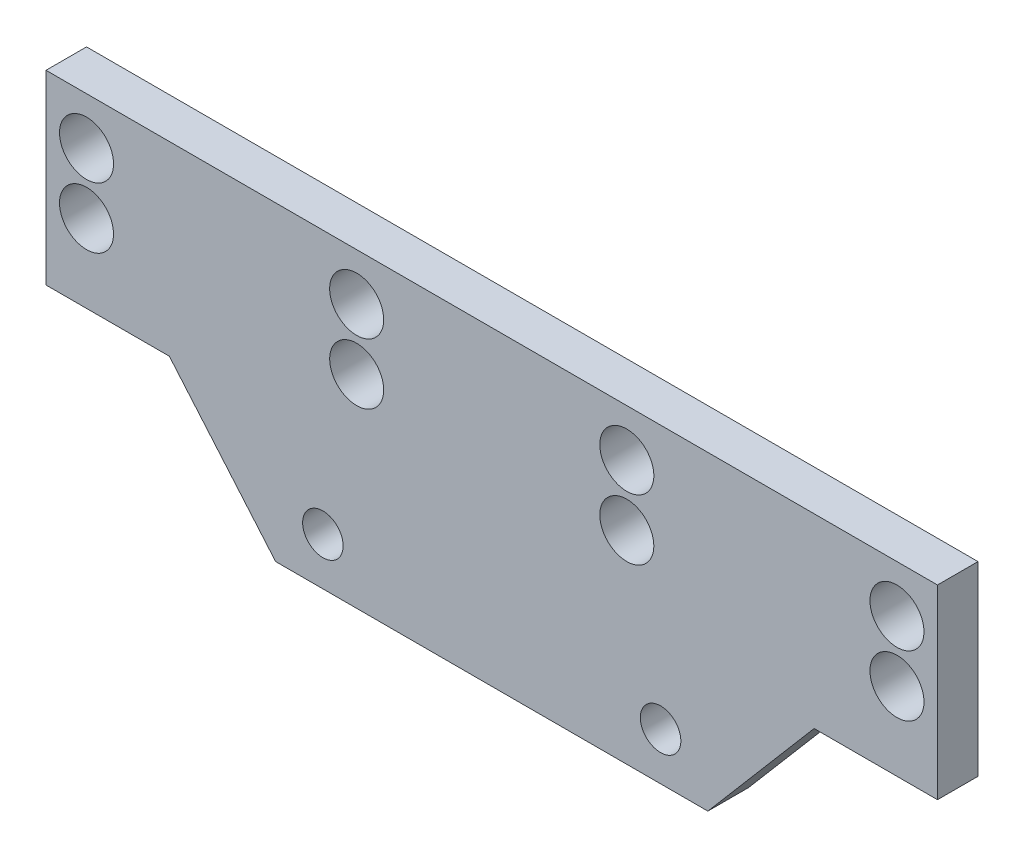
ISO-10303-21;
HEADER;
FILE_DESCRIPTION(('STEP AP214'),'2;1');
FILE_NAME('part.step','',(''),(''),'','','');
FILE_SCHEMA(('AUTOMOTIVE_DESIGN { 1 0 10303 214 1 1 1 1 }'));
ENDSEC;
DATA;
#1=APPLICATION_CONTEXT('core data for automotive mechanical design processes');
#2=APPLICATION_PROTOCOL_DEFINITION('international standard','automotive_design',2000,#1);
#3=PRODUCT_CONTEXT('',#1,'mechanical');
#4=PRODUCT('Part','Part','',(#3));
#5=PRODUCT_RELATED_PRODUCT_CATEGORY('part','',(#4));
#6=PRODUCT_DEFINITION_FORMATION('','',#4);
#7=PRODUCT_DEFINITION_CONTEXT('part definition',#1,'design');
#8=PRODUCT_DEFINITION('design','',#6,#7);
#9=PRODUCT_DEFINITION_SHAPE('','',#8);
#10=(LENGTH_UNIT() NAMED_UNIT(*) SI_UNIT(.MILLI.,.METRE.));
#11=(NAMED_UNIT(*) PLANE_ANGLE_UNIT() SI_UNIT($,.RADIAN.));
#12=(NAMED_UNIT(*) SI_UNIT($,.STERADIAN.) SOLID_ANGLE_UNIT());
#13=UNCERTAINTY_MEASURE_WITH_UNIT(LENGTH_MEASURE(1.E-05),#10,'distance_accuracy_value','');
#14=(GEOMETRIC_REPRESENTATION_CONTEXT(3) GLOBAL_UNCERTAINTY_ASSIGNED_CONTEXT((#13)) GLOBAL_UNIT_ASSIGNED_CONTEXT((#10,
#11,#12)) REPRESENTATION_CONTEXT('',''));
#15=CARTESIAN_POINT('',(0.,0.,0.));
#16=DIRECTION('',(0.,0.,1.));
#17=DIRECTION('',(1.,0.,0.));
#18=AXIS2_PLACEMENT_3D('',#15,#16,#17);
#19=CARTESIAN_POINT('',(0.,0.,3.));
#20=DIRECTION('',(0.,0.,1.));
#21=DIRECTION('',(1.,0.,0.));
#22=AXIS2_PLACEMENT_3D('',#19,#20,#21);
#23=PLANE('',#22);
#24=DIRECTION('',(-0.648671971691303,-0.761068113339481,0.));
#25=VECTOR('',#24,1.);
#26=CARTESIAN_POINT('',(28.2172131806052,11.707841663983,3.));
#27=LINE('',#26,#25);
#28=CARTESIAN_POINT('',(28.2172131806052,11.707841663983,3.));
#29=VERTEX_POINT('',#28);
#30=CARTESIAN_POINT('',(20.3498376661294,2.47727690854336,3.));
#31=VERTEX_POINT('',#30);
#32=EDGE_CURVE('E49',#29,#31,#27,.T.);
#33=ORIENTED_EDGE('',*,*,#32,.F.);
#34=DIRECTION('',(-1.,0.,0.));
#35=VECTOR('',#34,1.);
#36=CARTESIAN_POINT('',(37.3498376661295,11.707841663983,3.));
#37=LINE('',#36,#35);
#38=CARTESIAN_POINT('',(37.3498376661295,11.707841663983,3.));
#39=VERTEX_POINT('',#38);
#40=EDGE_CURVE('E115',#39,#29,#37,.T.);
#41=ORIENTED_EDGE('',*,*,#40,.F.);
#42=DIRECTION('',(0.,1.,0.));
#43=VECTOR('',#42,1.);
#44=CARTESIAN_POINT('',(37.3498376661295,25.4772769085434,3.));
#45=LINE('',#44,#43);
#46=CARTESIAN_POINT('',(37.3498376661295,25.4772769085434,3.));
#47=VERTEX_POINT('',#46);
#48=EDGE_CURVE('E119',#39,#47,#45,.T.);
#49=ORIENTED_EDGE('',*,*,#48,.T.);
#50=DIRECTION('',(-1.,0.,0.));
#51=VECTOR('',#50,1.);
#52=CARTESIAN_POINT('',(-28.6501623338706,25.4772769085434,3.));
#53=LINE('',#52,#51);
#54=CARTESIAN_POINT('',(-28.6501623338706,25.4772769085434,3.));
#55=VERTEX_POINT('',#54);
#56=EDGE_CURVE('E122',#47,#55,#53,.T.);
#57=ORIENTED_EDGE('',*,*,#56,.T.);
#58=DIRECTION('',(0.,-1.,0.));
#59=VECTOR('',#58,1.);
#60=CARTESIAN_POINT('',(-28.6501623338706,25.4772769085434,3.));
#61=LINE('',#60,#59);
#62=CARTESIAN_POINT('',(-28.6501623338706,11.707841663983,3.));
#63=VERTEX_POINT('',#62);
#64=EDGE_CURVE('E134',#55,#63,#61,.T.);
#65=ORIENTED_EDGE('',*,*,#64,.T.);
#66=DIRECTION('',(-1.,0.,0.));
#67=VECTOR('',#66,1.);
#68=CARTESIAN_POINT('',(-28.6501623338706,11.707841663983,3.));
#69=LINE('',#68,#67);
#70=CARTESIAN_POINT('',(-19.5175378483463,11.707841663983,3.));
#71=VERTEX_POINT('',#70);
#72=EDGE_CURVE('E161',#71,#63,#69,.T.);
#73=ORIENTED_EDGE('',*,*,#72,.F.);
#74=DIRECTION('',(-0.648671971691304,0.761068113339481,0.));
#75=VECTOR('',#74,1.);
#76=CARTESIAN_POINT('',(-19.5175378483463,11.707841663983,3.));
#77=LINE('',#76,#75);
#78=CARTESIAN_POINT('',(-11.6501623338705,2.47727690854335,3.));
#79=VERTEX_POINT('',#78);
#80=EDGE_CURVE('E226',#79,#71,#77,.T.);
#81=ORIENTED_EDGE('',*,*,#80,.F.);
#82=DIRECTION('',(1.,0.,0.));
#83=VECTOR('',#82,1.);
#84=CARTESIAN_POINT('',(-28.6501623338706,2.47727690854336,3.));
#85=LINE('',#84,#83);
#86=EDGE_CURVE('E129',#79,#31,#85,.T.);
#87=ORIENTED_EDGE('',*,*,#86,.T.);
#88=EDGE_LOOP('',(#33,#41,#49,#57,#65,#73,#81,#87));
#89=FACE_BOUND('',#88,.T.);
#90=CARTESIAN_POINT('',(-8.15016233387055,5.97727690854335,3.));
#91=DIRECTION('',(0.,0.,1.));
#92=DIRECTION('',(1.,0.,0.));
#93=AXIS2_PLACEMENT_3D('',#90,#91,#92);
#94=CIRCLE('',#93,1.5);
#95=CARTESIAN_POINT('',(-6.65016233387055,5.97727690854335,3.));
#96=VERTEX_POINT('',#95);
#97=EDGE_CURVE('E210',#96,#96,#94,.T.);
#98=ORIENTED_EDGE('',*,*,#97,.F.);
#99=EDGE_LOOP('',(#98));
#100=FACE_BOUND('',#99,.T.);
#101=CARTESIAN_POINT('',(-5.65016233387055,17.4772769085434,3.));
#102=DIRECTION('',(0.,0.,1.));
#103=DIRECTION('',(-1.,0.,0.));
#104=AXIS2_PLACEMENT_3D('',#101,#102,#103);
#105=CIRCLE('',#104,2.);
#106=CARTESIAN_POINT('',(-7.65016233387055,17.4772769085434,3.));
#107=VERTEX_POINT('',#106);
#108=EDGE_CURVE('E198',#107,#107,#105,.T.);
#109=ORIENTED_EDGE('',*,*,#108,.F.);
#110=EDGE_LOOP('',(#109));
#111=FACE_BOUND('',#110,.T.);
#112=CARTESIAN_POINT('',(34.3498376661295,17.4772769085434,3.));
#113=DIRECTION('',(0.,0.,1.));
#114=DIRECTION('',(1.,0.,0.));
#115=AXIS2_PLACEMENT_3D('',#112,#113,#114);
#116=CIRCLE('',#115,2.);
#117=CARTESIAN_POINT('',(36.3498376661295,17.4772769085434,3.));
#118=VERTEX_POINT('',#117);
#119=EDGE_CURVE('E186',#118,#118,#116,.T.);
#120=ORIENTED_EDGE('',*,*,#119,.F.);
#121=EDGE_LOOP('',(#120));
#122=FACE_BOUND('',#121,.T.);
#123=CARTESIAN_POINT('',(14.3498376661295,21.9772769085434,3.));
#124=DIRECTION('',(0.,0.,1.));
#125=DIRECTION('',(-1.,0.,0.));
#126=AXIS2_PLACEMENT_3D('',#123,#124,#125);
#127=CIRCLE('',#126,2.00000000000001);
#128=CARTESIAN_POINT('',(12.3498376661294,21.9772769085434,3.));
#129=VERTEX_POINT('',#128);
#130=EDGE_CURVE('E174',#129,#129,#127,.T.);
#131=ORIENTED_EDGE('',*,*,#130,.F.);
#132=EDGE_LOOP('',(#131));
#133=FACE_BOUND('',#132,.T.);
#134=CARTESIAN_POINT('',(-5.65016233387055,21.9772769085434,3.));
#135=DIRECTION('',(0.,0.,1.));
#136=DIRECTION('',(1.,0.,0.));
#137=AXIS2_PLACEMENT_3D('',#134,#135,#136);
#138=CIRCLE('',#137,2.);
#139=CARTESIAN_POINT('',(-3.65016233387055,21.9772769085434,3.));
#140=VERTEX_POINT('',#139);
#141=EDGE_CURVE('E143',#140,#140,#138,.T.);
#142=ORIENTED_EDGE('',*,*,#141,.F.);
#143=EDGE_LOOP('',(#142));
#144=FACE_BOUND('',#143,.T.);
#145=CARTESIAN_POINT('',(-25.6501623338706,21.9772769085434,3.));
#146=DIRECTION('',(0.,0.,1.));
#147=DIRECTION('',(1.,0.,0.));
#148=AXIS2_PLACEMENT_3D('',#145,#146,#147);
#149=CIRCLE('',#148,2.00000000000001);
#150=CARTESIAN_POINT('',(-23.6501623338705,21.9772769085434,3.));
#151=VERTEX_POINT('',#150);
#152=EDGE_CURVE('E168',#151,#151,#149,.T.);
#153=ORIENTED_EDGE('',*,*,#152,.F.);
#154=EDGE_LOOP('',(#153));
#155=FACE_BOUND('',#154,.T.);
#156=CARTESIAN_POINT('',(34.3498376661295,21.9772769085434,3.));
#157=DIRECTION('',(0.,0.,1.));
#158=DIRECTION('',(-1.,0.,0.));
#159=AXIS2_PLACEMENT_3D('',#156,#157,#158);
#160=CIRCLE('',#159,2.);
#161=CARTESIAN_POINT('',(32.3498376661295,21.9772769085434,3.));
#162=VERTEX_POINT('',#161);
#163=EDGE_CURVE('E180',#162,#162,#160,.T.);
#164=ORIENTED_EDGE('',*,*,#163,.F.);
#165=EDGE_LOOP('',(#164));
#166=FACE_BOUND('',#165,.T.);
#167=CARTESIAN_POINT('',(14.3498376661295,17.4772769085434,3.));
#168=DIRECTION('',(0.,0.,1.));
#169=DIRECTION('',(1.,0.,0.));
#170=AXIS2_PLACEMENT_3D('',#167,#168,#169);
#171=CIRCLE('',#170,2.00000000000001);
#172=CARTESIAN_POINT('',(16.3498376661295,17.4772769085434,3.));
#173=VERTEX_POINT('',#172);
#174=EDGE_CURVE('E192',#173,#173,#171,.T.);
#175=ORIENTED_EDGE('',*,*,#174,.F.);
#176=EDGE_LOOP('',(#175));
#177=FACE_BOUND('',#176,.T.);
#178=CARTESIAN_POINT('',(-25.6501623338705,17.4772769085434,3.));
#179=DIRECTION('',(0.,0.,1.));
#180=DIRECTION('',(-1.,0.,0.));
#181=AXIS2_PLACEMENT_3D('',#178,#179,#180);
#182=CIRCLE('',#181,2.00000000000001);
#183=CARTESIAN_POINT('',(-27.6501623338706,17.4772769085434,3.));
#184=VERTEX_POINT('',#183);
#185=EDGE_CURVE('E204',#184,#184,#182,.T.);
#186=ORIENTED_EDGE('',*,*,#185,.F.);
#187=EDGE_LOOP('',(#186));
#188=FACE_BOUND('',#187,.T.);
#189=CARTESIAN_POINT('',(16.8498376661295,5.97727690854336,3.));
#190=DIRECTION('',(0.,0.,1.));
#191=DIRECTION('',(-1.,0.,0.));
#192=AXIS2_PLACEMENT_3D('',#189,#190,#191);
#193=CIRCLE('',#192,1.5);
#194=CARTESIAN_POINT('',(15.3498376661295,5.97727690854336,3.));
#195=VERTEX_POINT('',#194);
#196=EDGE_CURVE('E216',#195,#195,#193,.T.);
#197=ORIENTED_EDGE('',*,*,#196,.F.);
#198=EDGE_LOOP('',(#197));
#199=FACE_BOUND('',#198,.T.);
#200=ADVANCED_FACE('F34',(#89,#100,#111,#122,#133,#144,#155,#166,#177,#188,#199),#23,.T.);
#201=CARTESIAN_POINT('',(0.,0.,0.));
#202=DIRECTION('',(0.,0.,1.));
#203=DIRECTION('',(1.,0.,0.));
#204=AXIS2_PLACEMENT_3D('',#201,#202,#203);
#205=PLANE('',#204);
#206=DIRECTION('',(-1.,0.,0.));
#207=VECTOR('',#206,1.);
#208=CARTESIAN_POINT('',(37.3498376661295,11.707841663983,0.));
#209=LINE('',#208,#207);
#210=CARTESIAN_POINT('',(37.3498376661295,11.707841663983,0.));
#211=VERTEX_POINT('',#210);
#212=CARTESIAN_POINT('',(28.2172131806052,11.707841663983,0.));
#213=VERTEX_POINT('',#212);
#214=EDGE_CURVE('E107',#211,#213,#209,.T.);
#215=ORIENTED_EDGE('',*,*,#214,.T.);
#216=DIRECTION('',(-0.648671971691303,-0.761068113339481,0.));
#217=VECTOR('',#216,1.);
#218=CARTESIAN_POINT('',(28.2172131806052,11.707841663983,0.));
#219=LINE('',#218,#217);
#220=CARTESIAN_POINT('',(20.3498376661295,2.47727690854335,0.));
#221=VERTEX_POINT('',#220);
#222=EDGE_CURVE('E100',#213,#221,#219,.T.);
#223=ORIENTED_EDGE('',*,*,#222,.T.);
#224=DIRECTION('',(1.,0.,0.));
#225=VECTOR('',#224,1.);
#226=CARTESIAN_POINT('',(-28.6501623338706,2.47727690854336,0.));
#227=LINE('',#226,#225);
#228=CARTESIAN_POINT('',(-11.6501623338706,2.47727690854336,0.));
#229=VERTEX_POINT('',#228);
#230=EDGE_CURVE('E113',#229,#221,#227,.T.);
#231=ORIENTED_EDGE('',*,*,#230,.F.);
#232=DIRECTION('',(-0.648671971691304,0.761068113339481,0.));
#233=VECTOR('',#232,1.);
#234=CARTESIAN_POINT('',(-19.5175378483463,11.707841663983,0.));
#235=LINE('',#234,#233);
#236=CARTESIAN_POINT('',(-19.5175378483463,11.707841663983,0.));
#237=VERTEX_POINT('',#236);
#238=EDGE_CURVE('E57',#229,#237,#235,.T.);
#239=ORIENTED_EDGE('',*,*,#238,.T.);
#240=DIRECTION('',(-1.,0.,0.));
#241=VECTOR('',#240,1.);
#242=CARTESIAN_POINT('',(-28.6501623338706,11.707841663983,0.));
#243=LINE('',#242,#241);
#244=CARTESIAN_POINT('',(-28.6501623338706,11.707841663983,0.));
#245=VERTEX_POINT('',#244);
#246=EDGE_CURVE('E151',#237,#245,#243,.T.);
#247=ORIENTED_EDGE('',*,*,#246,.T.);
#248=DIRECTION('',(0.,-1.,0.));
#249=VECTOR('',#248,1.);
#250=CARTESIAN_POINT('',(-28.6501623338706,25.4772769085434,0.));
#251=LINE('',#250,#249);
#252=CARTESIAN_POINT('',(-28.6501623338706,25.4772769085434,0.));
#253=VERTEX_POINT('',#252);
#254=EDGE_CURVE('E120',#253,#245,#251,.T.);
#255=ORIENTED_EDGE('',*,*,#254,.F.);
#256=DIRECTION('',(-1.,0.,0.));
#257=VECTOR('',#256,1.);
#258=CARTESIAN_POINT('',(-28.6501623338706,25.4772769085434,0.));
#259=LINE('',#258,#257);
#260=CARTESIAN_POINT('',(37.3498376661295,25.4772769085434,0.));
#261=VERTEX_POINT('',#260);
#262=EDGE_CURVE('E125',#261,#253,#259,.T.);
#263=ORIENTED_EDGE('',*,*,#262,.F.);
#264=DIRECTION('',(0.,1.,0.));
#265=VECTOR('',#264,1.);
#266=CARTESIAN_POINT('',(37.3498376661295,25.4772769085434,0.));
#267=LINE('',#266,#265);
#268=EDGE_CURVE('E142',#211,#261,#267,.T.);
#269=ORIENTED_EDGE('',*,*,#268,.F.);
#270=EDGE_LOOP('',(#215,#223,#231,#239,#247,#255,#263,#269));
#271=FACE_BOUND('',#270,.T.);
#272=CARTESIAN_POINT('',(-5.65016233387055,21.9772769085434,0.));
#273=DIRECTION('',(0.,0.,1.));
#274=DIRECTION('',(1.,0.,0.));
#275=AXIS2_PLACEMENT_3D('',#272,#273,#274);
#276=CIRCLE('',#275,2.);
#277=CARTESIAN_POINT('',(-3.65016233387055,21.9772769085434,0.));
#278=VERTEX_POINT('',#277);
#279=EDGE_CURVE('E165',#278,#278,#276,.T.);
#280=ORIENTED_EDGE('',*,*,#279,.T.);
#281=EDGE_LOOP('',(#280));
#282=FACE_BOUND('',#281,.T.);
#283=CARTESIAN_POINT('',(-25.6501623338706,21.9772769085434,0.));
#284=DIRECTION('',(0.,0.,1.));
#285=DIRECTION('',(1.,0.,0.));
#286=AXIS2_PLACEMENT_3D('',#283,#284,#285);
#287=CIRCLE('',#286,2.00000000000001);
#288=CARTESIAN_POINT('',(-23.6501623338705,21.9772769085434,0.));
#289=VERTEX_POINT('',#288);
#290=EDGE_CURVE('E171',#289,#289,#287,.T.);
#291=ORIENTED_EDGE('',*,*,#290,.T.);
#292=EDGE_LOOP('',(#291));
#293=FACE_BOUND('',#292,.T.);
#294=CARTESIAN_POINT('',(14.3498376661295,21.9772769085434,0.));
#295=DIRECTION('',(0.,0.,1.));
#296=DIRECTION('',(-1.,0.,0.));
#297=AXIS2_PLACEMENT_3D('',#294,#295,#296);
#298=CIRCLE('',#297,2.00000000000001);
#299=CARTESIAN_POINT('',(12.3498376661294,21.9772769085434,0.));
#300=VERTEX_POINT('',#299);
#301=EDGE_CURVE('E177',#300,#300,#298,.T.);
#302=ORIENTED_EDGE('',*,*,#301,.T.);
#303=EDGE_LOOP('',(#302));
#304=FACE_BOUND('',#303,.T.);
#305=CARTESIAN_POINT('',(34.3498376661295,21.9772769085434,0.));
#306=DIRECTION('',(0.,0.,1.));
#307=DIRECTION('',(-1.,0.,0.));
#308=AXIS2_PLACEMENT_3D('',#305,#306,#307);
#309=CIRCLE('',#308,2.);
#310=CARTESIAN_POINT('',(32.3498376661295,21.9772769085434,0.));
#311=VERTEX_POINT('',#310);
#312=EDGE_CURVE('E183',#311,#311,#309,.T.);
#313=ORIENTED_EDGE('',*,*,#312,.T.);
#314=EDGE_LOOP('',(#313));
#315=FACE_BOUND('',#314,.T.);
#316=CARTESIAN_POINT('',(34.3498376661295,17.4772769085434,0.));
#317=DIRECTION('',(0.,0.,1.));
#318=DIRECTION('',(1.,0.,0.));
#319=AXIS2_PLACEMENT_3D('',#316,#317,#318);
#320=CIRCLE('',#319,2.);
#321=CARTESIAN_POINT('',(36.3498376661295,17.4772769085434,0.));
#322=VERTEX_POINT('',#321);
#323=EDGE_CURVE('E189',#322,#322,#320,.T.);
#324=ORIENTED_EDGE('',*,*,#323,.T.);
#325=EDGE_LOOP('',(#324));
#326=FACE_BOUND('',#325,.T.);
#327=CARTESIAN_POINT('',(14.3498376661295,17.4772769085434,0.));
#328=DIRECTION('',(0.,0.,1.));
#329=DIRECTION('',(1.,0.,0.));
#330=AXIS2_PLACEMENT_3D('',#327,#328,#329);
#331=CIRCLE('',#330,2.00000000000001);
#332=CARTESIAN_POINT('',(16.3498376661295,17.4772769085434,0.));
#333=VERTEX_POINT('',#332);
#334=EDGE_CURVE('E195',#333,#333,#331,.T.);
#335=ORIENTED_EDGE('',*,*,#334,.T.);
#336=EDGE_LOOP('',(#335));
#337=FACE_BOUND('',#336,.T.);
#338=CARTESIAN_POINT('',(-5.65016233387055,17.4772769085434,0.));
#339=DIRECTION('',(0.,0.,1.));
#340=DIRECTION('',(-1.,0.,0.));
#341=AXIS2_PLACEMENT_3D('',#338,#339,#340);
#342=CIRCLE('',#341,2.);
#343=CARTESIAN_POINT('',(-7.65016233387055,17.4772769085434,0.));
#344=VERTEX_POINT('',#343);
#345=EDGE_CURVE('E201',#344,#344,#342,.T.);
#346=ORIENTED_EDGE('',*,*,#345,.T.);
#347=EDGE_LOOP('',(#346));
#348=FACE_BOUND('',#347,.T.);
#349=CARTESIAN_POINT('',(-25.6501623338705,17.4772769085434,0.));
#350=DIRECTION('',(0.,0.,1.));
#351=DIRECTION('',(-1.,0.,0.));
#352=AXIS2_PLACEMENT_3D('',#349,#350,#351);
#353=CIRCLE('',#352,2.00000000000001);
#354=CARTESIAN_POINT('',(-27.6501623338706,17.4772769085434,0.));
#355=VERTEX_POINT('',#354);
#356=EDGE_CURVE('E207',#355,#355,#353,.T.);
#357=ORIENTED_EDGE('',*,*,#356,.T.);
#358=EDGE_LOOP('',(#357));
#359=FACE_BOUND('',#358,.T.);
#360=CARTESIAN_POINT('',(-8.15016233387055,5.97727690854335,0.));
#361=DIRECTION('',(0.,0.,1.));
#362=DIRECTION('',(1.,0.,0.));
#363=AXIS2_PLACEMENT_3D('',#360,#361,#362);
#364=CIRCLE('',#363,1.5);
#365=CARTESIAN_POINT('',(-6.65016233387055,5.97727690854335,0.));
#366=VERTEX_POINT('',#365);
#367=EDGE_CURVE('E213',#366,#366,#364,.T.);
#368=ORIENTED_EDGE('',*,*,#367,.T.);
#369=EDGE_LOOP('',(#368));
#370=FACE_BOUND('',#369,.T.);
#371=CARTESIAN_POINT('',(16.8498376661295,5.97727690854336,0.));
#372=DIRECTION('',(0.,0.,1.));
#373=DIRECTION('',(-1.,0.,0.));
#374=AXIS2_PLACEMENT_3D('',#371,#372,#373);
#375=CIRCLE('',#374,1.5);
#376=CARTESIAN_POINT('',(15.3498376661295,5.97727690854336,0.));
#377=VERTEX_POINT('',#376);
#378=EDGE_CURVE('E156',#377,#377,#375,.T.);
#379=ORIENTED_EDGE('',*,*,#378,.T.);
#380=EDGE_LOOP('',(#379));
#381=FACE_BOUND('',#380,.T.);
#382=ADVANCED_FACE('F111',(#271,#282,#293,#304,#315,#326,#337,#348,#359,#370,#381),#205,.F.);
#383=CARTESIAN_POINT('',(37.3498376661295,25.4772769085434,3.));
#384=DIRECTION('',(-1.,0.,0.));
#385=DIRECTION('',(0.,0.,1.));
#386=AXIS2_PLACEMENT_3D('',#383,#384,#385);
#387=PLANE('',#386);
#388=ORIENTED_EDGE('',*,*,#48,.F.);
#389=DIRECTION('',(0.,0.,1.));
#390=VECTOR('',#389,1.);
#391=CARTESIAN_POINT('',(37.3498376661295,11.707841663983,0.));
#392=LINE('',#391,#390);
#393=EDGE_CURVE('E106',#211,#39,#392,.T.);
#394=ORIENTED_EDGE('',*,*,#393,.F.);
#395=ORIENTED_EDGE('',*,*,#268,.T.);
#396=DIRECTION('',(0.,0.,-1.));
#397=VECTOR('',#396,1.);
#398=CARTESIAN_POINT('',(37.3498376661295,25.4772769085434,3.));
#399=LINE('',#398,#397);
#400=EDGE_CURVE('E11',#47,#261,#399,.T.);
#401=ORIENTED_EDGE('',*,*,#400,.F.);
#402=EDGE_LOOP('',(#388,#394,#395,#401));
#403=FACE_BOUND('',#402,.T.);
#404=ADVANCED_FACE('F36',(#403),#387,.F.);
#405=CARTESIAN_POINT('',(-28.6501623338706,25.4772769085434,3.));
#406=DIRECTION('',(0.,-1.,0.));
#407=DIRECTION('',(0.,0.,-1.));
#408=AXIS2_PLACEMENT_3D('',#405,#406,#407);
#409=PLANE('',#408);
#410=ORIENTED_EDGE('',*,*,#262,.T.);
#411=DIRECTION('',(0.,0.,-1.));
#412=VECTOR('',#411,1.);
#413=CARTESIAN_POINT('',(-28.6501623338706,25.4772769085434,3.));
#414=LINE('',#413,#412);
#415=EDGE_CURVE('E42',#55,#253,#414,.T.);
#416=ORIENTED_EDGE('',*,*,#415,.F.);
#417=ORIENTED_EDGE('',*,*,#56,.F.);
#418=ORIENTED_EDGE('',*,*,#400,.T.);
#419=EDGE_LOOP('',(#410,#416,#417,#418));
#420=FACE_BOUND('',#419,.T.);
#421=ADVANCED_FACE('F146',(#420),#409,.F.);
#422=CARTESIAN_POINT('',(-28.6501623338706,25.4772769085434,3.));
#423=DIRECTION('',(1.,0.,0.));
#424=DIRECTION('',(0.,0.,-1.));
#425=AXIS2_PLACEMENT_3D('',#422,#423,#424);
#426=PLANE('',#425);
#427=ORIENTED_EDGE('',*,*,#254,.T.);
#428=DIRECTION('',(0.,0.,1.));
#429=VECTOR('',#428,1.);
#430=CARTESIAN_POINT('',(-28.6501623338706,11.707841663983,0.));
#431=LINE('',#430,#429);
#432=EDGE_CURVE('E154',#245,#63,#431,.T.);
#433=ORIENTED_EDGE('',*,*,#432,.T.);
#434=ORIENTED_EDGE('',*,*,#64,.F.);
#435=ORIENTED_EDGE('',*,*,#415,.T.);
#436=EDGE_LOOP('',(#427,#433,#434,#435));
#437=FACE_BOUND('',#436,.T.);
#438=ADVANCED_FACE('F153',(#437),#426,.F.);
#439=CARTESIAN_POINT('',(-28.6501623338706,2.47727690854336,3.));
#440=DIRECTION('',(0.,1.,0.));
#441=DIRECTION('',(-1.,0.,0.));
#442=AXIS2_PLACEMENT_3D('',#439,#440,#441);
#443=PLANE('',#442);
#444=ORIENTED_EDGE('',*,*,#230,.T.);
#445=DIRECTION('',(0.,0.,1.));
#446=VECTOR('',#445,1.);
#447=CARTESIAN_POINT('',(20.3498376661295,2.47727690854335,0.));
#448=LINE('',#447,#446);
#449=EDGE_CURVE('E97',#221,#31,#448,.T.);
#450=ORIENTED_EDGE('',*,*,#449,.T.);
#451=ORIENTED_EDGE('',*,*,#86,.F.);
#452=DIRECTION('',(0.,0.,1.));
#453=VECTOR('',#452,1.);
#454=CARTESIAN_POINT('',(-11.6501623338705,2.47727690854335,0.));
#455=LINE('',#454,#453);
#456=EDGE_CURVE('E118',#229,#79,#455,.T.);
#457=ORIENTED_EDGE('',*,*,#456,.F.);
#458=EDGE_LOOP('',(#444,#450,#451,#457));
#459=FACE_BOUND('',#458,.T.);
#460=ADVANCED_FACE('F117',(#459),#443,.F.);
#461=CARTESIAN_POINT('',(-5.65016233387055,21.9772769085434,3.));
#462=DIRECTION('',(0.,0.,-1.));
#463=DIRECTION('',(-1.,0.,0.));
#464=AXIS2_PLACEMENT_3D('',#461,#462,#463);
#465=CYLINDRICAL_SURFACE('',#464,2.);
#466=ORIENTED_EDGE('',*,*,#141,.T.);
#467=EDGE_LOOP('',(#466));
#468=FACE_BOUND('',#467,.T.);
#469=ORIENTED_EDGE('',*,*,#279,.F.);
#470=EDGE_LOOP('',(#469));
#471=FACE_BOUND('',#470,.T.);
#472=ADVANCED_FACE('F252',(#468,#471),#465,.F.);
#473=CARTESIAN_POINT('',(-25.6501623338706,21.9772769085434,3.));
#474=DIRECTION('',(0.,0.,-1.));
#475=DIRECTION('',(-1.,0.,0.));
#476=AXIS2_PLACEMENT_3D('',#473,#474,#475);
#477=CYLINDRICAL_SURFACE('',#476,2.00000000000001);
#478=ORIENTED_EDGE('',*,*,#152,.T.);
#479=EDGE_LOOP('',(#478));
#480=FACE_BOUND('',#479,.T.);
#481=ORIENTED_EDGE('',*,*,#290,.F.);
#482=EDGE_LOOP('',(#481));
#483=FACE_BOUND('',#482,.T.);
#484=ADVANCED_FACE('F273',(#480,#483),#477,.F.);
#485=CARTESIAN_POINT('',(14.3498376661295,21.9772769085434,3.));
#486=DIRECTION('',(0.,0.,-1.));
#487=DIRECTION('',(-1.,0.,0.));
#488=AXIS2_PLACEMENT_3D('',#485,#486,#487);
#489=CYLINDRICAL_SURFACE('',#488,2.00000000000001);
#490=ORIENTED_EDGE('',*,*,#130,.T.);
#491=EDGE_LOOP('',(#490));
#492=FACE_BOUND('',#491,.T.);
#493=ORIENTED_EDGE('',*,*,#301,.F.);
#494=EDGE_LOOP('',(#493));
#495=FACE_BOUND('',#494,.T.);
#496=ADVANCED_FACE('F280',(#492,#495),#489,.F.);
#497=CARTESIAN_POINT('',(34.3498376661295,21.9772769085434,3.));
#498=DIRECTION('',(0.,0.,-1.));
#499=DIRECTION('',(-1.,0.,0.));
#500=AXIS2_PLACEMENT_3D('',#497,#498,#499);
#501=CYLINDRICAL_SURFACE('',#500,2.);
#502=ORIENTED_EDGE('',*,*,#163,.T.);
#503=EDGE_LOOP('',(#502));
#504=FACE_BOUND('',#503,.T.);
#505=ORIENTED_EDGE('',*,*,#312,.F.);
#506=EDGE_LOOP('',(#505));
#507=FACE_BOUND('',#506,.T.);
#508=ADVANCED_FACE('F287',(#504,#507),#501,.F.);
#509=CARTESIAN_POINT('',(34.3498376661295,17.4772769085434,3.));
#510=DIRECTION('',(0.,0.,-1.));
#511=DIRECTION('',(-1.,0.,0.));
#512=AXIS2_PLACEMENT_3D('',#509,#510,#511);
#513=CYLINDRICAL_SURFACE('',#512,2.);
#514=ORIENTED_EDGE('',*,*,#119,.T.);
#515=EDGE_LOOP('',(#514));
#516=FACE_BOUND('',#515,.T.);
#517=ORIENTED_EDGE('',*,*,#323,.F.);
#518=EDGE_LOOP('',(#517));
#519=FACE_BOUND('',#518,.T.);
#520=ADVANCED_FACE('F295',(#516,#519),#513,.F.);
#521=CARTESIAN_POINT('',(14.3498376661295,17.4772769085434,3.));
#522=DIRECTION('',(0.,0.,-1.));
#523=DIRECTION('',(-1.,0.,0.));
#524=AXIS2_PLACEMENT_3D('',#521,#522,#523);
#525=CYLINDRICAL_SURFACE('',#524,2.00000000000001);
#526=ORIENTED_EDGE('',*,*,#174,.T.);
#527=EDGE_LOOP('',(#526));
#528=FACE_BOUND('',#527,.T.);
#529=ORIENTED_EDGE('',*,*,#334,.F.);
#530=EDGE_LOOP('',(#529));
#531=FACE_BOUND('',#530,.T.);
#532=ADVANCED_FACE('F303',(#528,#531),#525,.F.);
#533=CARTESIAN_POINT('',(-5.65016233387055,17.4772769085434,3.));
#534=DIRECTION('',(0.,0.,-1.));
#535=DIRECTION('',(-1.,0.,0.));
#536=AXIS2_PLACEMENT_3D('',#533,#534,#535);
#537=CYLINDRICAL_SURFACE('',#536,2.);
#538=ORIENTED_EDGE('',*,*,#108,.T.);
#539=EDGE_LOOP('',(#538));
#540=FACE_BOUND('',#539,.T.);
#541=ORIENTED_EDGE('',*,*,#345,.F.);
#542=EDGE_LOOP('',(#541));
#543=FACE_BOUND('',#542,.T.);
#544=ADVANCED_FACE('F311',(#540,#543),#537,.F.);
#545=CARTESIAN_POINT('',(-25.6501623338705,17.4772769085434,3.));
#546=DIRECTION('',(0.,0.,-1.));
#547=DIRECTION('',(-1.,0.,0.));
#548=AXIS2_PLACEMENT_3D('',#545,#546,#547);
#549=CYLINDRICAL_SURFACE('',#548,2.00000000000001);
#550=ORIENTED_EDGE('',*,*,#185,.T.);
#551=EDGE_LOOP('',(#550));
#552=FACE_BOUND('',#551,.T.);
#553=ORIENTED_EDGE('',*,*,#356,.F.);
#554=EDGE_LOOP('',(#553));
#555=FACE_BOUND('',#554,.T.);
#556=ADVANCED_FACE('F319',(#552,#555),#549,.F.);
#557=CARTESIAN_POINT('',(-8.15016233387055,5.97727690854335,3.));
#558=DIRECTION('',(0.,0.,-1.));
#559=DIRECTION('',(-1.,0.,0.));
#560=AXIS2_PLACEMENT_3D('',#557,#558,#559);
#561=CYLINDRICAL_SURFACE('',#560,1.5);
#562=ORIENTED_EDGE('',*,*,#97,.T.);
#563=EDGE_LOOP('',(#562));
#564=FACE_BOUND('',#563,.T.);
#565=ORIENTED_EDGE('',*,*,#367,.F.);
#566=EDGE_LOOP('',(#565));
#567=FACE_BOUND('',#566,.T.);
#568=ADVANCED_FACE('F327',(#564,#567),#561,.F.);
#569=CARTESIAN_POINT('',(16.8498376661295,5.97727690854336,3.));
#570=DIRECTION('',(0.,0.,-1.));
#571=DIRECTION('',(-1.,0.,0.));
#572=AXIS2_PLACEMENT_3D('',#569,#570,#571);
#573=CYLINDRICAL_SURFACE('',#572,1.5);
#574=ORIENTED_EDGE('',*,*,#196,.T.);
#575=EDGE_LOOP('',(#574));
#576=FACE_BOUND('',#575,.T.);
#577=ORIENTED_EDGE('',*,*,#378,.F.);
#578=EDGE_LOOP('',(#577));
#579=FACE_BOUND('',#578,.T.);
#580=ADVANCED_FACE('F335',(#576,#579),#573,.F.);
#581=CARTESIAN_POINT('',(-28.6501623338706,11.707841663983,0.));
#582=DIRECTION('',(0.,1.,0.));
#583=DIRECTION('',(-1.,0.,0.));
#584=AXIS2_PLACEMENT_3D('',#581,#582,#583);
#585=PLANE('',#584);
#586=ORIENTED_EDGE('',*,*,#72,.T.);
#587=ORIENTED_EDGE('',*,*,#432,.F.);
#588=ORIENTED_EDGE('',*,*,#246,.F.);
#589=DIRECTION('',(0.,0.,1.));
#590=VECTOR('',#589,1.);
#591=CARTESIAN_POINT('',(-19.5175378483463,11.707841663983,0.));
#592=LINE('',#591,#590);
#593=EDGE_CURVE('E157',#237,#71,#592,.T.);
#594=ORIENTED_EDGE('',*,*,#593,.T.);
#595=EDGE_LOOP('',(#586,#587,#588,#594));
#596=FACE_BOUND('',#595,.T.);
#597=ADVANCED_FACE('F343',(#596),#585,.F.);
#598=CARTESIAN_POINT('',(-19.5175378483463,11.707841663983,0.));
#599=DIRECTION('',(0.76106811333948,0.648671971691304,0.));
#600=DIRECTION('',(-0.648671971691304,0.761068113339481,0.));
#601=AXIS2_PLACEMENT_3D('',#598,#599,#600);
#602=PLANE('',#601);
#603=ORIENTED_EDGE('',*,*,#80,.T.);
#604=ORIENTED_EDGE('',*,*,#593,.F.);
#605=ORIENTED_EDGE('',*,*,#238,.F.);
#606=ORIENTED_EDGE('',*,*,#456,.T.);
#607=EDGE_LOOP('',(#603,#604,#605,#606));
#608=FACE_BOUND('',#607,.T.);
#609=ADVANCED_FACE('F350',(#608),#602,.F.);
#610=CARTESIAN_POINT('',(28.2172131806052,11.707841663983,0.));
#611=DIRECTION('',(-0.761068113339481,0.648671971691304,0.));
#612=DIRECTION('',(-0.648671971691304,-0.761068113339481,0.));
#613=AXIS2_PLACEMENT_3D('',#610,#611,#612);
#614=PLANE('',#613);
#615=ORIENTED_EDGE('',*,*,#32,.T.);
#616=ORIENTED_EDGE('',*,*,#449,.F.);
#617=ORIENTED_EDGE('',*,*,#222,.F.);
#618=DIRECTION('',(0.,0.,1.));
#619=VECTOR('',#618,1.);
#620=CARTESIAN_POINT('',(28.2172131806052,11.707841663983,0.));
#621=LINE('',#620,#619);
#622=EDGE_CURVE('E229',#213,#29,#621,.T.);
#623=ORIENTED_EDGE('',*,*,#622,.T.);
#624=EDGE_LOOP('',(#615,#616,#617,#623));
#625=FACE_BOUND('',#624,.T.);
#626=ADVANCED_FACE('F99',(#625),#614,.F.);
#627=CARTESIAN_POINT('',(37.3498376661295,11.707841663983,0.));
#628=DIRECTION('',(0.,1.,0.));
#629=DIRECTION('',(-1.,0.,0.));
#630=AXIS2_PLACEMENT_3D('',#627,#628,#629);
#631=PLANE('',#630);
#632=ORIENTED_EDGE('',*,*,#40,.T.);
#633=ORIENTED_EDGE('',*,*,#622,.F.);
#634=ORIENTED_EDGE('',*,*,#214,.F.);
#635=ORIENTED_EDGE('',*,*,#393,.T.);
#636=EDGE_LOOP('',(#632,#633,#634,#635));
#637=FACE_BOUND('',#636,.T.);
#638=ADVANCED_FACE('F238',(#637),#631,.F.);
#639=CLOSED_SHELL('',(#200,#382,#404,#421,#438,#460,#472,#484,#496,#508,#520,#532,#544,#556,
#568,#580,#597,#609,#626,#638));
#640=MANIFOLD_SOLID_BREP('B2',#639);
#641=ADVANCED_BREP_SHAPE_REPRESENTATION('',(#18,#640),#14);
#642=SHAPE_DEFINITION_REPRESENTATION(#9,#641);
ENDSEC;
END-ISO-10303-21;
